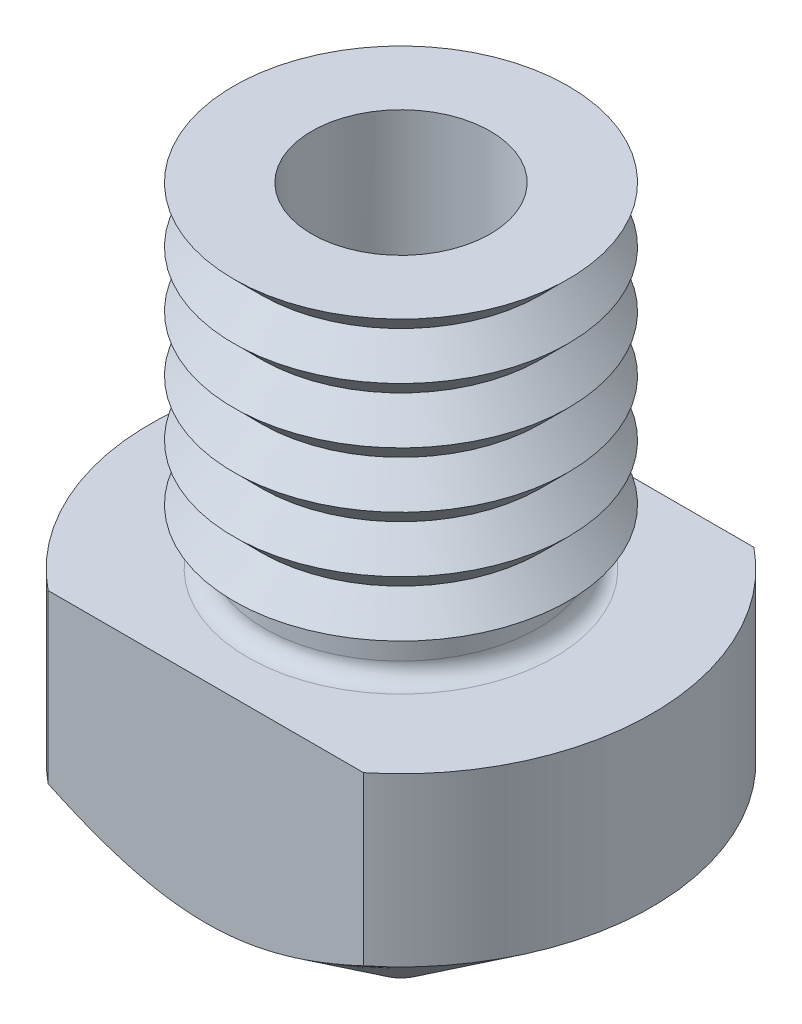
ISO-10303-21;
HEADER;
FILE_DESCRIPTION(('STEP AP214'),'2;1');
FILE_NAME('part.step','',(''),(''),'','','');
FILE_SCHEMA(('AUTOMOTIVE_DESIGN { 1 0 10303 214 1 1 1 1 }'));
ENDSEC;
DATA;
#1=APPLICATION_CONTEXT('core data for automotive mechanical design processes');
#2=APPLICATION_PROTOCOL_DEFINITION('international standard','automotive_design',2000,#1);
#3=PRODUCT_CONTEXT('',#1,'mechanical');
#4=PRODUCT('Part','Part','',(#3));
#5=PRODUCT_RELATED_PRODUCT_CATEGORY('part','',(#4));
#6=PRODUCT_DEFINITION_FORMATION('','',#4);
#7=PRODUCT_DEFINITION_CONTEXT('part definition',#1,'design');
#8=PRODUCT_DEFINITION('design','',#6,#7);
#9=PRODUCT_DEFINITION_SHAPE('','',#8);
#10=(LENGTH_UNIT() NAMED_UNIT(*) SI_UNIT(.MILLI.,.METRE.));
#11=(NAMED_UNIT(*) PLANE_ANGLE_UNIT() SI_UNIT($,.RADIAN.));
#12=(NAMED_UNIT(*) SI_UNIT($,.STERADIAN.) SOLID_ANGLE_UNIT());
#13=UNCERTAINTY_MEASURE_WITH_UNIT(LENGTH_MEASURE(1.E-05),#10,'distance_accuracy_value','');
#14=(GEOMETRIC_REPRESENTATION_CONTEXT(3) GLOBAL_UNCERTAINTY_ASSIGNED_CONTEXT((#13)) GLOBAL_UNIT_ASSIGNED_CONTEXT((#10,
#11,#12)) REPRESENTATION_CONTEXT('',''));
#15=CARTESIAN_POINT('',(0.,0.,0.));
#16=DIRECTION('',(0.,0.,1.));
#17=DIRECTION('',(1.,0.,0.));
#18=AXIS2_PLACEMENT_3D('',#15,#16,#17);
#19=CARTESIAN_POINT('',(0.,-20.2000000000453,0.));
#20=DIRECTION('',(0.,-1.,0.));
#21=DIRECTION('',(0.,0.,-1.));
#22=AXIS2_PLACEMENT_3D('',#19,#20,#21);
#23=CONICAL_SURFACE('',#22,3.00000000004275,0.785398163397448);
#24=CARTESIAN_POINT('',(0.,-19.7000000000003,0.));
#25=DIRECTION('',(0.,1.,0.));
#26=DIRECTION('',(-1.,0.,0.));
#27=AXIS2_PLACEMENT_3D('',#24,#25,#26);
#28=CIRCLE('',#27,2.49999999999773);
#29=CARTESIAN_POINT('',(-2.49999999999773,-19.7000000000003,0.));
#30=VERTEX_POINT('',#29);
#31=EDGE_CURVE('E158',#30,#30,#28,.T.);
#32=ORIENTED_EDGE('',*,*,#31,.F.);
#33=EDGE_LOOP('',(#32));
#34=FACE_BOUND('',#33,.T.);
#35=CARTESIAN_POINT('',(0.,-20.2000000000453,0.));
#36=DIRECTION('',(0.,-1.,0.));
#37=DIRECTION('',(0.,0.,-1.));
#38=AXIS2_PLACEMENT_3D('',#35,#36,#37);
#39=CIRCLE('',#38,3.00000000004275);
#40=CARTESIAN_POINT('',(0.,-20.2000000000453,-3.00000000004275));
#41=VERTEX_POINT('',#40);
#42=EDGE_CURVE('E19',#41,#41,#39,.T.);
#43=ORIENTED_EDGE('',*,*,#42,.F.);
#44=EDGE_LOOP('',(#43));
#45=FACE_BOUND('',#44,.T.);
#46=ADVANCED_FACE('F16',(#34,#45),#23,.T.);
#47=CARTESIAN_POINT('',(0.,-19.2000000000689,0.));
#48=DIRECTION('',(0.,1.,0.));
#49=DIRECTION('',(0.,0.,1.));
#50=AXIS2_PLACEMENT_3D('',#47,#48,#49);
#51=CONICAL_SURFACE('',#50,2.99999999992906,0.785398163397448);
#52=CARTESIAN_POINT('',(0.,-19.2000000000121,0.));
#53=DIRECTION('',(0.,-1.,0.));
#54=DIRECTION('',(-1.,0.,0.));
#55=AXIS2_PLACEMENT_3D('',#52,#53,#54);
#56=CIRCLE('',#55,2.9999999999859);
#57=CARTESIAN_POINT('',(-2.9999999999859,-19.2000000000121,0.));
#58=VERTEX_POINT('',#57);
#59=EDGE_CURVE('E139',#58,#58,#56,.F.);
#60=ORIENTED_EDGE('',*,*,#59,.F.);
#61=EDGE_LOOP('',(#60));
#62=FACE_BOUND('',#61,.T.);
#63=ORIENTED_EDGE('',*,*,#31,.T.);
#64=EDGE_LOOP('',(#63));
#65=FACE_BOUND('',#64,.T.);
#66=ADVANCED_FACE('F304',(#62,#65),#51,.T.);
#67=CARTESIAN_POINT('',(0.,-20.2,0.));
#68=DIRECTION('',(0.,-1.,0.));
#69=DIRECTION('',(1.,0.,0.));
#70=AXIS2_PLACEMENT_3D('',#67,#68,#69);
#71=PLANE('',#70);
#72=CARTESIAN_POINT('',(0.,-20.2,0.));
#73=DIRECTION('',(0.,-1.,0.));
#74=DIRECTION('',(-1.,0.,0.));
#75=AXIS2_PLACEMENT_3D('',#72,#73,#74);
#76=CIRCLE('',#75,2.75);
#77=CARTESIAN_POINT('',(-2.75,-20.2,0.));
#78=VERTEX_POINT('',#77);
#79=EDGE_CURVE('E136',#78,#78,#76,.F.);
#80=ORIENTED_EDGE('',*,*,#79,.T.);
#81=EDGE_LOOP('',(#80));
#82=FACE_BOUND('',#81,.T.);
#83=ORIENTED_EDGE('',*,*,#42,.T.);
#84=EDGE_LOOP('',(#83));
#85=FACE_BOUND('',#84,.T.);
#86=ADVANCED_FACE('F294',(#82,#85),#71,.T.);
#87=CARTESIAN_POINT('',(0.,-19.2000000000121,0.));
#88=DIRECTION('',(0.,-1.,0.));
#89=DIRECTION('',(0.,0.,-1.));
#90=AXIS2_PLACEMENT_3D('',#87,#88,#89);
#91=CONICAL_SURFACE('',#90,2.9999999999859,0.785398163397448);
#92=CARTESIAN_POINT('',(0.,-18.6999999999671,0.));
#93=DIRECTION('',(0.,1.,0.));
#94=DIRECTION('',(-1.,0.,0.));
#95=AXIS2_PLACEMENT_3D('',#92,#93,#94);
#96=CIRCLE('',#95,2.49999999999773);
#97=CARTESIAN_POINT('',(-2.49999999999773,-18.6999999999671,0.));
#98=VERTEX_POINT('',#97);
#99=EDGE_CURVE('E133',#98,#98,#96,.T.);
#100=ORIENTED_EDGE('',*,*,#99,.F.);
#101=EDGE_LOOP('',(#100));
#102=FACE_BOUND('',#101,.T.);
#103=ORIENTED_EDGE('',*,*,#59,.T.);
#104=EDGE_LOOP('',(#103));
#105=FACE_BOUND('',#104,.T.);
#106=ADVANCED_FACE('F148',(#102,#105),#91,.T.);
#107=CARTESIAN_POINT('',(0.,-20.5,0.));
#108=DIRECTION('',(0.,1.,0.));
#109=DIRECTION('',(-1.,0.,0.));
#110=AXIS2_PLACEMENT_3D('',#107,#108,#109);
#111=TOROIDAL_SURFACE('',#110,2.75,0.3);
#112=CARTESIAN_POINT('',(0.,-20.5,0.));
#113=DIRECTION('',(0.,-1.,0.));
#114=DIRECTION('',(1.,0.,0.));
#115=AXIS2_PLACEMENT_3D('',#112,#113,#114);
#116=CIRCLE('',#115,2.45);
#117=CARTESIAN_POINT('',(2.45,-20.5,0.));
#118=VERTEX_POINT('',#117);
#119=EDGE_CURVE('E130',#118,#118,#116,.T.);
#120=ORIENTED_EDGE('',*,*,#119,.F.);
#121=EDGE_LOOP('',(#120));
#122=FACE_BOUND('',#121,.T.);
#123=ORIENTED_EDGE('',*,*,#79,.F.);
#124=EDGE_LOOP('',(#123));
#125=FACE_BOUND('',#124,.T.);
#126=ADVANCED_FACE('F142',(#122,#125),#111,.F.);
#127=CARTESIAN_POINT('',(0.,-18.1999999998652,0.));
#128=DIRECTION('',(0.,1.,0.));
#129=DIRECTION('',(0.,0.,1.));
#130=AXIS2_PLACEMENT_3D('',#127,#128,#129);
#131=CONICAL_SURFACE('',#130,3.00000000009959,0.785398163397448);
#132=CARTESIAN_POINT('',(0.,-18.1999999999789,0.));
#133=DIRECTION('',(0.,-1.,0.));
#134=DIRECTION('',(-1.,0.,0.));
#135=AXIS2_PLACEMENT_3D('',#132,#133,#134);
#136=CIRCLE('',#135,2.9999999999859);
#137=CARTESIAN_POINT('',(-2.9999999999859,-18.1999999999789,0.));
#138=VERTEX_POINT('',#137);
#139=EDGE_CURVE('E119',#138,#138,#136,.F.);
#140=ORIENTED_EDGE('',*,*,#139,.F.);
#141=EDGE_LOOP('',(#140));
#142=FACE_BOUND('',#141,.T.);
#143=ORIENTED_EDGE('',*,*,#99,.T.);
#144=EDGE_LOOP('',(#143));
#145=FACE_BOUND('',#144,.T.);
#146=ADVANCED_FACE('F147',(#142,#145),#131,.T.);
#147=CARTESIAN_POINT('',(0.,-20.5,0.));
#148=DIRECTION('',(0.,-1.,0.));
#149=DIRECTION('',(1.,0.,0.));
#150=AXIS2_PLACEMENT_3D('',#147,#148,#149);
#151=CYLINDRICAL_SURFACE('',#150,2.45);
#152=CARTESIAN_POINT('',(0.,-20.9,0.));
#153=DIRECTION('',(0.,1.,0.));
#154=DIRECTION('',(-1.,0.,0.));
#155=AXIS2_PLACEMENT_3D('',#152,#153,#154);
#156=CIRCLE('',#155,2.45);
#157=CARTESIAN_POINT('',(-2.45,-20.9,0.));
#158=VERTEX_POINT('',#157);
#159=EDGE_CURVE('E116',#158,#158,#156,.T.);
#160=ORIENTED_EDGE('',*,*,#159,.T.);
#161=EDGE_LOOP('',(#160));
#162=FACE_BOUND('',#161,.T.);
#163=ORIENTED_EDGE('',*,*,#119,.T.);
#164=EDGE_LOOP('',(#163));
#165=FACE_BOUND('',#164,.T.);
#166=ADVANCED_FACE('F285',(#162,#165),#151,.T.);
#167=CARTESIAN_POINT('',(0.,-18.1999999998652,0.));
#168=DIRECTION('',(0.,-1.,0.));
#169=DIRECTION('',(0.,0.,-1.));
#170=AXIS2_PLACEMENT_3D('',#167,#168,#169);
#171=CONICAL_SURFACE('',#170,2.99999999987222,0.785398163397448);
#172=CARTESIAN_POINT('',(0.,-17.7000000000476,0.));
#173=DIRECTION('',(0.,1.,0.));
#174=DIRECTION('',(-1.,0.,0.));
#175=AXIS2_PLACEMENT_3D('',#172,#173,#174);
#176=CIRCLE('',#175,2.49999999999773);
#177=CARTESIAN_POINT('',(-2.49999999999773,-17.7000000000476,0.));
#178=VERTEX_POINT('',#177);
#179=EDGE_CURVE('E115',#178,#178,#176,.T.);
#180=ORIENTED_EDGE('',*,*,#179,.F.);
#181=EDGE_LOOP('',(#180));
#182=FACE_BOUND('',#181,.T.);
#183=ORIENTED_EDGE('',*,*,#139,.T.);
#184=EDGE_LOOP('',(#183));
#185=FACE_BOUND('',#184,.T.);
#186=ADVANCED_FACE('F109',(#182,#185),#171,.T.);
#187=CARTESIAN_POINT('',(0.,-20.9,0.));
#188=DIRECTION('',(0.,1.,0.));
#189=DIRECTION('',(-1.,0.,0.));
#190=AXIS2_PLACEMENT_3D('',#187,#188,#189);
#191=TOROIDAL_SURFACE('',#190,2.75,0.3);
#192=CARTESIAN_POINT('',(0.,-21.2,0.));
#193=DIRECTION('',(0.,1.,0.));
#194=DIRECTION('',(-1.,0.,0.));
#195=AXIS2_PLACEMENT_3D('',#192,#193,#194);
#196=CIRCLE('',#195,2.75);
#197=CARTESIAN_POINT('',(-2.75,-21.2,0.));
#198=VERTEX_POINT('',#197);
#199=EDGE_CURVE('E82',#198,#198,#196,.T.);
#200=ORIENTED_EDGE('',*,*,#199,.T.);
#201=EDGE_LOOP('',(#200));
#202=FACE_BOUND('',#201,.T.);
#203=ORIENTED_EDGE('',*,*,#159,.F.);
#204=EDGE_LOOP('',(#203));
#205=FACE_BOUND('',#204,.T.);
#206=ADVANCED_FACE('F103',(#202,#205),#191,.F.);
#207=CARTESIAN_POINT('',(0.,-17.2000000000025,0.));
#208=DIRECTION('',(0.,1.,0.));
#209=DIRECTION('',(0.,0.,1.));
#210=AXIS2_PLACEMENT_3D('',#207,#208,#209);
#211=CONICAL_SURFACE('',#210,2.9999999999859,0.785398163340605);
#212=CARTESIAN_POINT('',(0.,-17.1999999999457,0.));
#213=DIRECTION('',(0.,-1.,0.));
#214=DIRECTION('',(-1.,0.,0.));
#215=AXIS2_PLACEMENT_3D('',#212,#213,#214);
#216=CIRCLE('',#215,2.9999999999859);
#217=CARTESIAN_POINT('',(-2.9999999999859,-17.1999999999457,0.));
#218=VERTEX_POINT('',#217);
#219=EDGE_CURVE('E76',#218,#218,#216,.F.);
#220=ORIENTED_EDGE('',*,*,#219,.F.);
#221=EDGE_LOOP('',(#220));
#222=FACE_BOUND('',#221,.T.);
#223=ORIENTED_EDGE('',*,*,#179,.T.);
#224=EDGE_LOOP('',(#223));
#225=FACE_BOUND('',#224,.T.);
#226=ADVANCED_FACE('F99',(#222,#225),#211,.T.);
#227=CARTESIAN_POINT('',(0.,-21.2,0.));
#228=DIRECTION('',(0.,-1.,0.));
#229=DIRECTION('',(1.,0.,0.));
#230=AXIS2_PLACEMENT_3D('',#227,#228,#229);
#231=PLANE('',#230);
#232=ORIENTED_EDGE('',*,*,#199,.F.);
#233=EDGE_LOOP('',(#232));
#234=FACE_BOUND('',#233,.T.);
#235=CARTESIAN_POINT('',(0.,-21.2,0.));
#236=DIRECTION('',(0.,-1.,0.));
#237=DIRECTION('',(1.,0.,0.));
#238=AXIS2_PLACEMENT_3D('',#235,#236,#237);
#239=CIRCLE('',#238,4.5);
#240=CARTESIAN_POINT('',(-2.82842712474613,-21.2,3.50000000000005));
#241=VERTEX_POINT('',#240);
#242=CARTESIAN_POINT('',(-2.82842712474609,-21.2,-3.5));
#243=VERTEX_POINT('',#242);
#244=EDGE_CURVE('E68',#241,#243,#239,.T.);
#245=ORIENTED_EDGE('',*,*,#244,.F.);
#246=DIRECTION('',(1.,0.,0.));
#247=VECTOR('',#246,1.);
#248=CARTESIAN_POINT('',(7.679282,-21.2,3.5));
#249=LINE('',#248,#247);
#250=CARTESIAN_POINT('',(2.8284271247461,-21.2,3.5));
#251=VERTEX_POINT('',#250);
#252=EDGE_CURVE('E64',#241,#251,#249,.T.);
#253=ORIENTED_EDGE('',*,*,#252,.T.);
#254=CARTESIAN_POINT('',(0.,-21.2,0.));
#255=DIRECTION('',(0.,-1.,0.));
#256=DIRECTION('',(1.,0.,0.));
#257=AXIS2_PLACEMENT_3D('',#254,#255,#256);
#258=CIRCLE('',#257,4.5);
#259=CARTESIAN_POINT('',(2.82842712474613,-21.2,-3.50000000000005));
#260=VERTEX_POINT('',#259);
#261=EDGE_CURVE('E54',#260,#251,#258,.T.);
#262=ORIENTED_EDGE('',*,*,#261,.F.);
#263=DIRECTION('',(1.,0.,0.));
#264=VECTOR('',#263,1.);
#265=CARTESIAN_POINT('',(7.517187,-21.2,-3.5));
#266=LINE('',#265,#264);
#267=EDGE_CURVE('E87',#243,#260,#266,.T.);
#268=ORIENTED_EDGE('',*,*,#267,.F.);
#269=EDGE_LOOP('',(#245,#253,#262,#268));
#270=FACE_BOUND('',#269,.T.);
#271=ADVANCED_FACE('F71',(#234,#270),#231,.F.);
#272=CARTESIAN_POINT('',(0.,-17.1999999999457,0.));
#273=DIRECTION('',(0.,-1.,0.));
#274=DIRECTION('',(0.,0.,-1.));
#275=AXIS2_PLACEMENT_3D('',#272,#273,#274);
#276=CONICAL_SURFACE('',#275,2.9999999999859,0.785398163397448);
#277=CARTESIAN_POINT('',(0.,-16.7000000000712,0.));
#278=DIRECTION('',(0.,1.,0.));
#279=DIRECTION('',(-1.,0.,0.));
#280=AXIS2_PLACEMENT_3D('',#277,#278,#279);
#281=CIRCLE('',#280,2.49999999999773);
#282=CARTESIAN_POINT('',(-2.49999999999773,-16.7000000000712,0.));
#283=VERTEX_POINT('',#282);
#284=EDGE_CURVE('E263',#283,#283,#281,.T.);
#285=ORIENTED_EDGE('',*,*,#284,.F.);
#286=EDGE_LOOP('',(#285));
#287=FACE_BOUND('',#286,.T.);
#288=ORIENTED_EDGE('',*,*,#219,.T.);
#289=EDGE_LOOP('',(#288));
#290=FACE_BOUND('',#289,.T.);
#291=ADVANCED_FACE('F98',(#287,#290),#276,.T.);
#292=CARTESIAN_POINT('',(7.517187,-21.2,-3.5));
#293=DIRECTION('',(0.,0.,-1.));
#294=DIRECTION('',(0.,1.,0.));
#295=AXIS2_PLACEMENT_3D('',#292,#293,#294);
#296=PLANE('',#295);
#297=CARTESIAN_POINT('',(-2.82842712478853,-24.2000000000227,-3.50000000000192));
#298=CARTESIAN_POINT('',(-2.7322852191494,-24.2453077237193,-3.50000000000069));
#299=CARTESIAN_POINT('',(-2.63560414784574,-24.2894989022155,-3.50000000000019));
#300=CARTESIAN_POINT('',(-2.4410041343265,-24.375192872606,-3.49999999999982));
#301=CARTESIAN_POINT('',(-2.3430846132851,-24.4166943473723,-3.49999999999995));
#302=CARTESIAN_POINT('',(-2.1452652974065,-24.4967823676051,-3.50000000000005));
#303=CARTESIAN_POINT('',(-2.04535652657225,-24.5353469670475,-3.50000000000002));
#304=CARTESIAN_POINT('',(-1.84416763388415,-24.608637383212,-3.49999999999999));
#305=CARTESIAN_POINT('',(-1.74288768906571,-24.643363690298,-3.5));
#306=CARTESIAN_POINT('',(-1.44048062748168,-24.7396309955781,-3.50000000000001));
#307=CARTESIAN_POINT('',(-1.23718996475973,-24.7947629239463,-3.5));
#308=CARTESIAN_POINT('',(-0.928889589618682,-24.8601301385355,-3.5));
#309=CARTESIAN_POINT('',(-0.825685276464273,-24.8790187061949,-3.5));
#310=CARTESIAN_POINT('',(-0.618319858735272,-24.9104405242216,-3.5));
#311=CARTESIAN_POINT('',(-0.514158905643378,-24.9229747637074,-3.5));
#312=CARTESIAN_POINT('',(-0.253850429090965,-24.9456568243482,-3.5));
#313=CARTESIAN_POINT('',(-0.0973115687814802,-24.9516044773482,-3.5));
#314=CARTESIAN_POINT('',(0.215614465231175,-24.9476458146024,-3.5));
#315=CARTESIAN_POINT('',(0.372001542477825,-24.937732554405,-3.5));
#316=CARTESIAN_POINT('',(0.683325272643012,-24.9029393888896,-3.5));
#317=CARTESIAN_POINT('',(0.838259041823709,-24.8780343249852,-3.5));
#318=CARTESIAN_POINT('',(1.14542267563266,-24.8152328020664,-3.5));
#319=CARTESIAN_POINT('',(1.29765237559902,-24.7773355547377,-3.5));
#320=CARTESIAN_POINT('',(1.56728018890829,-24.7000168979859,-3.5));
#321=CARTESIAN_POINT('',(1.685265148955,-24.6625954812612,-3.5));
#322=CARTESIAN_POINT('',(1.91932334137236,-24.5822292269613,-3.5));
#323=CARTESIAN_POINT('',(2.03539665377512,-24.5392846212839,-3.5));
#324=CARTESIAN_POINT('',(2.26525501358988,-24.4490372237623,-3.5));
#325=CARTESIAN_POINT('',(2.37904763846562,-24.4017535452245,-3.5));
#326=CARTESIAN_POINT('',(2.6049446576936,-24.3034733210472,-3.5));
#327=CARTESIAN_POINT('',(2.717049988076,-24.2524789330047,-3.5));
#328=CARTESIAN_POINT('',(2.82842712479254,-24.2000000000196,-3.5));
#329=B_SPLINE_CURVE_WITH_KNOTS('',3,(#297,#298,#299,#300,#301,#302,#303,#304,#305,#306,#307,
#308,#309,#310,#311,#312,#313,#314,#315,#316,#317,#318,#319,#320,#321,#322,#323,#324,#325,#326,
#327,#328),.UNSPECIFIED.,.F.,.F.,(4,2,2,2,2,2,2,2,2,2,2,2,2,2,2,4),(0.,0.318857816877411,
0.63787061433007,0.959071525183281,1.28023135323337,1.91088852002641,2.22547882149035,
2.54002013859017,3.00914395073156,3.47847321757295,3.9485922964865,4.41873990541899,
4.78992359254189,5.16109170016397,5.53069686070841,5.90008880512541),.UNSPECIFIED.);
#330=CARTESIAN_POINT('',(-2.8284271247971,-24.1999999999961,-3.5));
#331=VERTEX_POINT('',#330);
#332=CARTESIAN_POINT('',(2.82842712476944,-24.1999999999851,-3.50000000000005));
#333=VERTEX_POINT('',#332);
#334=EDGE_CURVE('E188',#331,#333,#329,.T.);
#335=ORIENTED_EDGE('',*,*,#334,.F.);
#336=DIRECTION('',(0.,1.,0.));
#337=VECTOR('',#336,1.);
#338=CARTESIAN_POINT('',(-2.828427124746,-21.2,-3.5));
#339=LINE('',#338,#337);
#340=EDGE_CURVE('E271',#331,#243,#339,.T.);
#341=ORIENTED_EDGE('',*,*,#340,.T.);
#342=ORIENTED_EDGE('',*,*,#267,.T.);
#343=DIRECTION('',(0.,-1.,0.));
#344=VECTOR('',#343,1.);
#345=CARTESIAN_POINT('',(2.82842712474607,-21.2,-3.50000000000009));
#346=LINE('',#345,#344);
#347=EDGE_CURVE('E60',#333,#260,#346,.F.);
#348=ORIENTED_EDGE('',*,*,#347,.F.);
#349=EDGE_LOOP('',(#335,#341,#342,#348));
#350=FACE_BOUND('',#349,.T.);
#351=ADVANCED_FACE('F369',(#350),#296,.T.);
#352=CARTESIAN_POINT('',(0.,-21.2,0.));
#353=DIRECTION('',(0.,-1.,0.));
#354=DIRECTION('',(1.,0.,0.));
#355=AXIS2_PLACEMENT_3D('',#352,#353,#354);
#356=CYLINDRICAL_SURFACE('',#355,4.5);
#357=DIRECTION('',(0.,1.,0.));
#358=VECTOR('',#357,1.);
#359=CARTESIAN_POINT('',(2.828427124746,-21.2,3.5));
#360=LINE('',#359,#358);
#361=CARTESIAN_POINT('',(2.8284271247971,-24.1999999999961,3.5));
#362=VERTEX_POINT('',#361);
#363=EDGE_CURVE('E58',#251,#362,#360,.F.);
#364=ORIENTED_EDGE('',*,*,#363,.T.);
#365=CARTESIAN_POINT('',(0.,-24.1999999999507,0.));
#366=DIRECTION('',(0.,1.,0.));
#367=DIRECTION('',(-1.,0.,0.));
#368=AXIS2_PLACEMENT_3D('',#365,#366,#367);
#369=CIRCLE('',#368,4.50000000006412);
#370=EDGE_CURVE('E187',#333,#362,#369,.F.);
#371=ORIENTED_EDGE('',*,*,#370,.F.);
#372=ORIENTED_EDGE('',*,*,#347,.T.);
#373=ORIENTED_EDGE('',*,*,#261,.T.);
#374=EDGE_LOOP('',(#364,#371,#372,#373));
#375=FACE_BOUND('',#374,.T.);
#376=ADVANCED_FACE('F56',(#375),#356,.T.);
#377=CARTESIAN_POINT('',(7.679282,-21.2,3.5));
#378=DIRECTION('',(0.,0.,-1.));
#379=DIRECTION('',(0.,1.,0.));
#380=AXIS2_PLACEMENT_3D('',#377,#378,#379);
#381=PLANE('',#380);
#382=CARTESIAN_POINT('',(2.82842712478853,-24.2000000000227,3.50000000000191));
#383=CARTESIAN_POINT('',(2.7322852191494,-24.2453077237193,3.50000000000069));
#384=CARTESIAN_POINT('',(2.63560414784574,-24.2894989022155,3.50000000000018));
#385=CARTESIAN_POINT('',(2.4410041343265,-24.375192872606,3.49999999999981));
#386=CARTESIAN_POINT('',(2.3430846132851,-24.4166943473723,3.49999999999995));
#387=CARTESIAN_POINT('',(2.14526529740651,-24.4967823676051,3.50000000000005));
#388=CARTESIAN_POINT('',(2.04535652657226,-24.5353469670475,3.50000000000001));
#389=CARTESIAN_POINT('',(1.84416763388416,-24.608637383212,3.49999999999999));
#390=CARTESIAN_POINT('',(1.74288768906572,-24.643363690298,3.49999999999999));
#391=CARTESIAN_POINT('',(1.44048062748169,-24.7396309955781,3.50000000000001));
#392=CARTESIAN_POINT('',(1.23718996475975,-24.7947629239463,3.5));
#393=CARTESIAN_POINT('',(0.928889589618691,-24.8601301385355,3.5));
#394=CARTESIAN_POINT('',(0.825685276464281,-24.8790187061949,3.5));
#395=CARTESIAN_POINT('',(0.618319858735279,-24.9104405242216,3.5));
#396=CARTESIAN_POINT('',(0.514158905643384,-24.9229747637074,3.5));
#397=CARTESIAN_POINT('',(0.253850429090971,-24.9456568243482,3.5));
#398=CARTESIAN_POINT('',(0.0973115687814847,-24.9516044773482,3.5));
#399=CARTESIAN_POINT('',(-0.215614465231172,-24.9476458146024,3.5));
#400=CARTESIAN_POINT('',(-0.372001542477823,-24.937732554405,3.5));
#401=CARTESIAN_POINT('',(-0.68332527264301,-24.9029393888896,3.5));
#402=CARTESIAN_POINT('',(-0.838259041823706,-24.8780343249852,3.5));
#403=CARTESIAN_POINT('',(-1.14542267563266,-24.8152328020664,3.5));
#404=CARTESIAN_POINT('',(-1.29765237559902,-24.7773355547377,3.5));
#405=CARTESIAN_POINT('',(-1.56728018890809,-24.700016897986,3.5));
#406=CARTESIAN_POINT('',(-1.68526514895461,-24.6625954812613,3.5));
#407=CARTESIAN_POINT('',(-1.9193233413716,-24.5822292269616,3.5));
#408=CARTESIAN_POINT('',(-2.03539665377418,-24.5392846212843,3.5));
#409=CARTESIAN_POINT('',(-2.26525501358858,-24.4490372237629,3.5));
#410=CARTESIAN_POINT('',(-2.37904763846414,-24.4017535452251,3.5));
#411=CARTESIAN_POINT('',(-2.60494465769178,-24.303473321048,3.5));
#412=CARTESIAN_POINT('',(-2.71704998807401,-24.2524789330056,3.5));
#413=CARTESIAN_POINT('',(-2.82842712479038,-24.2000000000206,3.5));
#414=B_SPLINE_CURVE_WITH_KNOTS('',3,(#382,#383,#384,#385,#386,#387,#388,#389,#390,#391,#392,
#393,#394,#395,#396,#397,#398,#399,#400,#401,#402,#403,#404,#405,#406,#407,#408,#409,#410,#411,
#412,#413),.UNSPECIFIED.,.F.,.F.,(4,2,2,2,2,2,2,2,2,2,2,2,2,2,2,4),(0.,0.318857816877405,
0.637870614330061,0.959071525183269,1.28023135323336,1.91088852002641,2.22547882149034,
2.54002013859016,3.00914395073156,3.47847321757295,3.9485922964865,4.41873990541898,
4.78992359254128,5.16109170016276,5.53069686070662,5.90008880512303),.UNSPECIFIED.);
#415=CARTESIAN_POINT('',(-2.82842712476825,-24.1999999999856,3.50000000000005));
#416=VERTEX_POINT('',#415);
#417=EDGE_CURVE('E34',#362,#416,#414,.T.);
#418=ORIENTED_EDGE('',*,*,#417,.F.);
#419=ORIENTED_EDGE('',*,*,#363,.F.);
#420=ORIENTED_EDGE('',*,*,#252,.F.);
#421=DIRECTION('',(0.,-1.,0.));
#422=VECTOR('',#421,1.);
#423=CARTESIAN_POINT('',(-2.82842712474608,-21.2,3.50000000000009));
#424=LINE('',#423,#422);
#425=EDGE_CURVE('E265',#416,#241,#424,.F.);
#426=ORIENTED_EDGE('',*,*,#425,.F.);
#427=EDGE_LOOP('',(#418,#419,#420,#426));
#428=FACE_BOUND('',#427,.T.);
#429=ADVANCED_FACE('F66',(#428),#381,.F.);
#430=CARTESIAN_POINT('',(0.,-21.2,0.));
#431=DIRECTION('',(0.,-1.,0.));
#432=DIRECTION('',(1.,0.,0.));
#433=AXIS2_PLACEMENT_3D('',#430,#431,#432);
#434=CYLINDRICAL_SURFACE('',#433,4.5);
#435=CARTESIAN_POINT('',(0.,-24.1999999999507,0.));
#436=DIRECTION('',(0.,1.,0.));
#437=DIRECTION('',(-1.,0.,0.));
#438=AXIS2_PLACEMENT_3D('',#435,#436,#437);
#439=CIRCLE('',#438,4.50000000006412);
#440=EDGE_CURVE('E186',#416,#331,#439,.F.);
#441=ORIENTED_EDGE('',*,*,#440,.F.);
#442=ORIENTED_EDGE('',*,*,#425,.T.);
#443=ORIENTED_EDGE('',*,*,#244,.T.);
#444=ORIENTED_EDGE('',*,*,#340,.F.);
#445=EDGE_LOOP('',(#441,#442,#443,#444));
#446=FACE_BOUND('',#445,.T.);
#447=ADVANCED_FACE('F206',(#446),#434,.T.);
#448=CARTESIAN_POINT('',(0.,-16.2000000000262,0.));
#449=DIRECTION('',(0.,1.,0.));
#450=DIRECTION('',(0.,0.,1.));
#451=AXIS2_PLACEMENT_3D('',#448,#449,#450);
#452=CONICAL_SURFACE('',#451,2.9999999999859,0.785398163340605);
#453=CARTESIAN_POINT('',(0.,-16.2000000000262,0.));
#454=DIRECTION('',(0.,-1.,0.));
#455=DIRECTION('',(-1.,0.,0.));
#456=AXIS2_PLACEMENT_3D('',#453,#454,#455);
#457=CIRCLE('',#456,2.9999999999859);
#458=CARTESIAN_POINT('',(-2.9999999999859,-16.2000000000262,0.));
#459=VERTEX_POINT('',#458);
#460=EDGE_CURVE('E179',#459,#459,#457,.F.);
#461=ORIENTED_EDGE('',*,*,#460,.F.);
#462=EDGE_LOOP('',(#461));
#463=FACE_BOUND('',#462,.T.);
#464=ORIENTED_EDGE('',*,*,#284,.T.);
#465=EDGE_LOOP('',(#464));
#466=FACE_BOUND('',#465,.T.);
#467=ADVANCED_FACE('F202',(#463,#466),#452,.T.);
#468=CARTESIAN_POINT('',(0.,-24.2000000001212,0.));
#469=DIRECTION('',(0.,1.,0.));
#470=DIRECTION('',(0.,0.,1.));
#471=AXIS2_PLACEMENT_3D('',#468,#469,#470);
#472=CONICAL_SURFACE('',#471,4.49999999989359,0.927295218010707);
#473=ORIENTED_EDGE('',*,*,#440,.T.);
#474=ORIENTED_EDGE('',*,*,#334,.T.);
#475=ORIENTED_EDGE('',*,*,#370,.T.);
#476=ORIENTED_EDGE('',*,*,#417,.T.);
#477=EDGE_LOOP('',(#473,#474,#475,#476));
#478=FACE_BOUND('',#477,.T.);
#479=CARTESIAN_POINT('',(0.,-27.1999999999935,0.));
#480=DIRECTION('',(0.,1.,0.));
#481=DIRECTION('',(0.,0.,1.));
#482=AXIS2_PLACEMENT_3D('',#479,#480,#481);
#483=CIRCLE('',#482,0.499999999988177);
#484=CARTESIAN_POINT('',(0.,-27.1999999999935,0.499999999988177));
#485=VERTEX_POINT('',#484);
#486=EDGE_CURVE('E176',#485,#485,#483,.F.);
#487=ORIENTED_EDGE('',*,*,#486,.F.);
#488=EDGE_LOOP('',(#487));
#489=FACE_BOUND('',#488,.T.);
#490=ADVANCED_FACE('F196',(#478,#489),#472,.T.);
#491=CARTESIAN_POINT('',(0.,-16.2000000000262,0.));
#492=DIRECTION('',(0.,-1.,0.));
#493=DIRECTION('',(0.,0.,-1.));
#494=AXIS2_PLACEMENT_3D('',#491,#492,#493);
#495=CONICAL_SURFACE('',#494,2.9999999999859,0.785398163340605);
#496=CARTESIAN_POINT('',(0.,-15.6999999999812,0.));
#497=DIRECTION('',(0.,1.,0.));
#498=DIRECTION('',(-1.,0.,0.));
#499=AXIS2_PLACEMENT_3D('',#496,#497,#498);
#500=CIRCLE('',#499,2.49999999994088);
#501=CARTESIAN_POINT('',(-2.49999999994088,-15.6999999999812,0.));
#502=VERTEX_POINT('',#501);
#503=EDGE_CURVE('E175',#502,#502,#500,.T.);
#504=ORIENTED_EDGE('',*,*,#503,.F.);
#505=EDGE_LOOP('',(#504));
#506=FACE_BOUND('',#505,.T.);
#507=ORIENTED_EDGE('',*,*,#460,.T.);
#508=EDGE_LOOP('',(#507));
#509=FACE_BOUND('',#508,.T.);
#510=ADVANCED_FACE('F201',(#506,#509),#495,.T.);
#511=CARTESIAN_POINT('',(0.,-27.2,0.));
#512=DIRECTION('',(0.,-1.,0.));
#513=DIRECTION('',(1.,0.,0.));
#514=AXIS2_PLACEMENT_3D('',#511,#512,#513);
#515=PLANE('',#514);
#516=CARTESIAN_POINT('',(0.,-27.2,0.));
#517=DIRECTION('',(0.,1.,0.));
#518=DIRECTION('',(-1.,0.,0.));
#519=AXIS2_PLACEMENT_3D('',#516,#517,#518);
#520=CIRCLE('',#519,0.25);
#521=CARTESIAN_POINT('',(-0.25,-27.2,0.));
#522=VERTEX_POINT('',#521);
#523=EDGE_CURVE('E172',#522,#522,#520,.T.);
#524=ORIENTED_EDGE('',*,*,#523,.T.);
#525=EDGE_LOOP('',(#524));
#526=FACE_BOUND('',#525,.T.);
#527=ORIENTED_EDGE('',*,*,#486,.T.);
#528=EDGE_LOOP('',(#527));
#529=FACE_BOUND('',#528,.T.);
#530=ADVANCED_FACE('F238',(#526,#529),#515,.T.);
#531=CARTESIAN_POINT('',(0.,-15.199999999993,0.));
#532=DIRECTION('',(0.,1.,0.));
#533=DIRECTION('',(0.,0.,1.));
#534=AXIS2_PLACEMENT_3D('',#531,#532,#533);
#535=CONICAL_SURFACE('',#534,2.99999999992906,0.785398163397448);
#536=CARTESIAN_POINT('',(0.,-15.199999999993,0.));
#537=DIRECTION('',(0.,1.,0.));
#538=DIRECTION('',(0.,0.,1.));
#539=AXIS2_PLACEMENT_3D('',#536,#537,#538);
#540=CIRCLE('',#539,2.99999999992906);
#541=CARTESIAN_POINT('',(0.,-15.199999999993,2.99999999992906));
#542=VERTEX_POINT('',#541);
#543=EDGE_CURVE('E169',#542,#542,#540,.F.);
#544=ORIENTED_EDGE('',*,*,#543,.T.);
#545=EDGE_LOOP('',(#544));
#546=FACE_BOUND('',#545,.T.);
#547=ORIENTED_EDGE('',*,*,#503,.T.);
#548=EDGE_LOOP('',(#547));
#549=FACE_BOUND('',#548,.T.);
#550=ADVANCED_FACE('F235',(#546,#549),#535,.T.);
#551=CARTESIAN_POINT('',(0.,-27.2,0.));
#552=DIRECTION('',(0.,1.,0.));
#553=DIRECTION('',(-1.,0.,0.));
#554=AXIS2_PLACEMENT_3D('',#551,#552,#553);
#555=CYLINDRICAL_SURFACE('',#554,0.25);
#556=CARTESIAN_POINT('',(0.,-25.6999999999721,0.));
#557=DIRECTION('',(0.,1.,0.));
#558=DIRECTION('',(-1.,0.,0.));
#559=AXIS2_PLACEMENT_3D('',#556,#557,#558);
#560=CIRCLE('',#559,0.249999999994088);
#561=CARTESIAN_POINT('',(0.,-25.6999999999721,0.249999999994087));
#562=VERTEX_POINT('',#561);
#563=EDGE_CURVE('E168',#562,#562,#560,.T.);
#564=ORIENTED_EDGE('',*,*,#563,.T.);
#565=EDGE_LOOP('',(#564));
#566=FACE_BOUND('',#565,.T.);
#567=ORIENTED_EDGE('',*,*,#523,.F.);
#568=EDGE_LOOP('',(#567));
#569=FACE_BOUND('',#568,.T.);
#570=ADVANCED_FACE('F231',(#566,#569),#555,.F.);
#571=CARTESIAN_POINT('',(0.,-15.2,0.));
#572=DIRECTION('',(0.,-1.,0.));
#573=DIRECTION('',(1.,0.,0.));
#574=AXIS2_PLACEMENT_3D('',#571,#572,#573);
#575=PLANE('',#574);
#576=ORIENTED_EDGE('',*,*,#543,.F.);
#577=EDGE_LOOP('',(#576));
#578=FACE_BOUND('',#577,.T.);
#579=CARTESIAN_POINT('',(0.,-15.2,0.));
#580=DIRECTION('',(0.,-1.,0.));
#581=DIRECTION('',(1.,0.,0.));
#582=AXIS2_PLACEMENT_3D('',#579,#580,#581);
#583=CIRCLE('',#582,1.6);
#584=CARTESIAN_POINT('',(1.6,-15.2,0.));
#585=VERTEX_POINT('',#584);
#586=EDGE_CURVE('E25',#585,#585,#583,.T.);
#587=ORIENTED_EDGE('',*,*,#586,.T.);
#588=EDGE_LOOP('',(#587));
#589=FACE_BOUND('',#588,.T.);
#590=ADVANCED_FACE('F223',(#578,#589),#575,.F.);
#591=CARTESIAN_POINT('',(0.,-24.0911326500282,0.));
#592=DIRECTION('',(0.,1.,0.));
#593=DIRECTION('',(0.,0.,1.));
#594=AXIS2_PLACEMENT_3D('',#591,#592,#593);
#595=CONICAL_SURFACE('',#594,1.59999999999627,0.69813170081636);
#596=CARTESIAN_POINT('',(0.,-24.09113265002,0.));
#597=DIRECTION('',(0.,-1.,0.));
#598=DIRECTION('',(1.,0.,0.));
#599=AXIS2_PLACEMENT_3D('',#596,#597,#598);
#600=CIRCLE('',#599,1.6);
#601=CARTESIAN_POINT('',(0.,-24.09113265002,1.60000000000311));
#602=VERTEX_POINT('',#601);
#603=EDGE_CURVE('E10',#602,#602,#600,.F.);
#604=CARTESIAN_POINT('',(0.,-25.6999999999721,0.249999999994087));
#605=CARTESIAN_POINT('',(0.,-25.6832409650767,0.264062499994181));
#606=CARTESIAN_POINT('',(0.,-25.6664819301814,0.278124999994275));
#607=CARTESIAN_POINT('',(0.,-25.6329638603907,0.306249999994464));
#608=CARTESIAN_POINT('',(0.,-25.6162048254954,0.320312499994558));
#609=CARTESIAN_POINT('',(0.,-25.5826867557047,0.348437499994746));
#610=CARTESIAN_POINT('',(0.,-25.5659277208094,0.362499999994839));
#611=CARTESIAN_POINT('',(0.,-25.5324096510187,0.390624999995027));
#612=CARTESIAN_POINT('',(0.,-25.5156506161234,0.404687499995122));
#613=CARTESIAN_POINT('',(0.,-25.4821325463327,0.43281249999531));
#614=CARTESIAN_POINT('',(0.,-25.4653735114374,0.446874999995404));
#615=CARTESIAN_POINT('',(0.,-25.4318554416467,0.474999999995592));
#616=CARTESIAN_POINT('',(0.,-25.4150964067514,0.489062499995686));
#617=CARTESIAN_POINT('',(0.,-25.3815783369607,0.517187499995874));
#618=CARTESIAN_POINT('',(0.,-25.3648193020654,0.531249999995968));
#619=CARTESIAN_POINT('',(0.,-25.3313012322747,0.559374999996156));
#620=CARTESIAN_POINT('',(0.,-25.3145421973794,0.57343749999625));
#621=CARTESIAN_POINT('',(0.,-25.2810241275887,0.601562499996439));
#622=CARTESIAN_POINT('',(0.,-25.2642650926934,0.615624999996532));
#623=CARTESIAN_POINT('',(0.,-25.2307470229027,0.64374999999672));
#624=CARTESIAN_POINT('',(0.,-25.2139879880074,0.657812499996815));
#625=CARTESIAN_POINT('',(0.,-25.1804699182167,0.685937499997003));
#626=CARTESIAN_POINT('',(0.,-25.1637108833214,0.699999999997096));
#627=CARTESIAN_POINT('',(0.,-25.1301928135307,0.728124999997284));
#628=CARTESIAN_POINT('',(0.,-25.1134337786354,0.742187499997379));
#629=CARTESIAN_POINT('',(0.,-25.0799157088447,0.770312499997567));
#630=CARTESIAN_POINT('',(0.,-25.0631566739494,0.78437499999766));
#631=CARTESIAN_POINT('',(0.,-25.0296386041587,0.812499999997848));
#632=CARTESIAN_POINT('',(0.,-25.0128795692634,0.826562499997943));
#633=CARTESIAN_POINT('',(0.,-24.9793614994727,0.854687499998131));
#634=CARTESIAN_POINT('',(0.,-24.9626024645774,0.868749999998225));
#635=CARTESIAN_POINT('',(0.,-24.9290843947867,0.896874999998412));
#636=CARTESIAN_POINT('',(0.,-24.9123253598914,0.910937499998507));
#637=CARTESIAN_POINT('',(0.,-24.8788072901007,0.939062499998695));
#638=CARTESIAN_POINT('',(0.,-24.8620482552054,0.953124999998789));
#639=CARTESIAN_POINT('',(0.,-24.8285301854147,0.981249999998977));
#640=CARTESIAN_POINT('',(0.,-24.8117711505194,0.995312499999071));
#641=CARTESIAN_POINT('',(0.,-24.7782530807287,1.02343749999926));
#642=CARTESIAN_POINT('',(0.,-24.7614940458334,1.03749999999935));
#643=CARTESIAN_POINT('',(0.,-24.7279759760427,1.06562499999954));
#644=CARTESIAN_POINT('',(0.,-24.7112169411474,1.07968749999963));
#645=CARTESIAN_POINT('',(0.,-24.6776988713567,1.10781249999982));
#646=CARTESIAN_POINT('',(0.,-24.6609398364614,1.12187499999992));
#647=CARTESIAN_POINT('',(0.,-24.6274217666707,1.15000000000011));
#648=CARTESIAN_POINT('',(0.,-24.6106627317754,1.1640625000002));
#649=CARTESIAN_POINT('',(0.,-24.5771446619847,1.19218750000039));
#650=CARTESIAN_POINT('',(0.,-24.5603856270894,1.20625000000048));
#651=CARTESIAN_POINT('',(0.,-24.5268675572987,1.23437500000067));
#652=CARTESIAN_POINT('',(0.,-24.5101085224034,1.24843750000076));
#653=CARTESIAN_POINT('',(0.,-24.4765904526127,1.27656250000095));
#654=CARTESIAN_POINT('',(0.,-24.4598314177174,1.29062500000105));
#655=CARTESIAN_POINT('',(0.,-24.4263133479267,1.31875000000123));
#656=CARTESIAN_POINT('',(0.,-24.4095543130314,1.33281250000133));
#657=CARTESIAN_POINT('',(0.,-24.3760362432407,1.36093750000152));
#658=CARTESIAN_POINT('',(0.,-24.3592772083454,1.37500000000161));
#659=CARTESIAN_POINT('',(0.,-24.3257591385547,1.4031250000018));
#660=CARTESIAN_POINT('',(0.,-24.3090001036593,1.41718750000189));
#661=CARTESIAN_POINT('',(0.,-24.2754820338687,1.44531250000208));
#662=CARTESIAN_POINT('',(0.,-24.2587229989733,1.45937500000217));
#663=CARTESIAN_POINT('',(0.,-24.2252049291827,1.48750000000236));
#664=CARTESIAN_POINT('',(0.,-24.2084458942873,1.50156250000246));
#665=CARTESIAN_POINT('',(0.,-24.1749278244967,1.52968750000264));
#666=CARTESIAN_POINT('',(0.,-24.1581687896013,1.54375000000274));
#667=CARTESIAN_POINT('',(0.,-24.1246507198107,1.57187500000293));
#668=CARTESIAN_POINT('',(0.,-24.1078916849153,1.58593750000302));
#669=CARTESIAN_POINT('',(0.,-24.09113265002,1.60000000000311));
#670=B_SPLINE_CURVE_WITH_KNOTS('',3,(#604,#605,#606,#607,#608,#609,#610,#611,#612,#613,#614,
#615,#616,#617,#618,#619,#620,#621,#622,#623,#624,#625,#626,#627,#628,#629,#630,#631,#632,#633,
#634,#635,#636,#637,#638,#639,#640,#641,#642,#643,#644,#645,#646,#647,#648,#649,#650,#651,#652,
#653,#654,#655,#656,#657,#658,#659,#660,#661,#662,#663,#664,#665,#666,#667,#668,#669),
.UNSPECIFIED.,.F.,.F.,(4,2,2,2,2,2,2,2,2,2,2,2,2,2,2,2,2,2,2,2,2,2,2,2,2,2,2,2,2,2,2,2,4),(0.,
0.0656320989446543,0.131264197889309,0.196896296833965,0.26252839577862,0.328160494723277,
0.393792593667931,0.459424692612588,0.525056791557242,0.590688890501899,0.656320989446553,
0.72195308839121,0.787585187335864,0.853217286280521,0.918849385225176,0.984481484169832,
1.05011358311449,1.11574568205914,1.1813777810038,1.24700987994845,1.31264197889311,
1.37827407783776,1.44390617678242,1.50953827572707,1.57517037467173,1.64080247361639,
1.70643457256104,1.7720666715057,1.83769877045035,1.90333086939501,1.96896296833966,
2.03459506728432,2.10022716622897),.UNSPECIFIED.);
#671=EDGE_CURVE('BSEAM217',#562,#602,#670,.T.);
#672=ORIENTED_EDGE('',*,*,#563,.F.);
#673=ORIENTED_EDGE('',*,*,#603,.T.);
#674=ORIENTED_EDGE('',*,*,#671,.T.);
#675=ORIENTED_EDGE('',*,*,#671,.F.);
#676=EDGE_LOOP('',(#672,#674,#673,#675));
#677=FACE_BOUND('',#676,.T.);
#678=ADVANCED_FACE('F217',(#677),#595,.F.);
#679=CARTESIAN_POINT('',(0.,-15.2,0.));
#680=DIRECTION('',(0.,-1.,0.));
#681=DIRECTION('',(1.,0.,0.));
#682=AXIS2_PLACEMENT_3D('',#679,#680,#681);
#683=CYLINDRICAL_SURFACE('',#682,1.6);
#684=ORIENTED_EDGE('',*,*,#603,.F.);
#685=EDGE_LOOP('',(#684));
#686=FACE_BOUND('',#685,.T.);
#687=ORIENTED_EDGE('',*,*,#586,.F.);
#688=EDGE_LOOP('',(#687));
#689=FACE_BOUND('',#688,.T.);
#690=ADVANCED_FACE('F215',(#686,#689),#683,.F.);
#691=CLOSED_SHELL('',(#46,#66,#86,#106,#126,#146,#166,#186,#206,#226,#271,#291,#351,#376,#429,
#447,#467,#490,#510,#530,#550,#570,#590,#678,#690));
#692=MANIFOLD_SOLID_BREP('B1',#691);
#693=ADVANCED_BREP_SHAPE_REPRESENTATION('',(#18,#692),#14);
#694=SHAPE_DEFINITION_REPRESENTATION(#9,#693);
ENDSEC;
END-ISO-10303-21;
